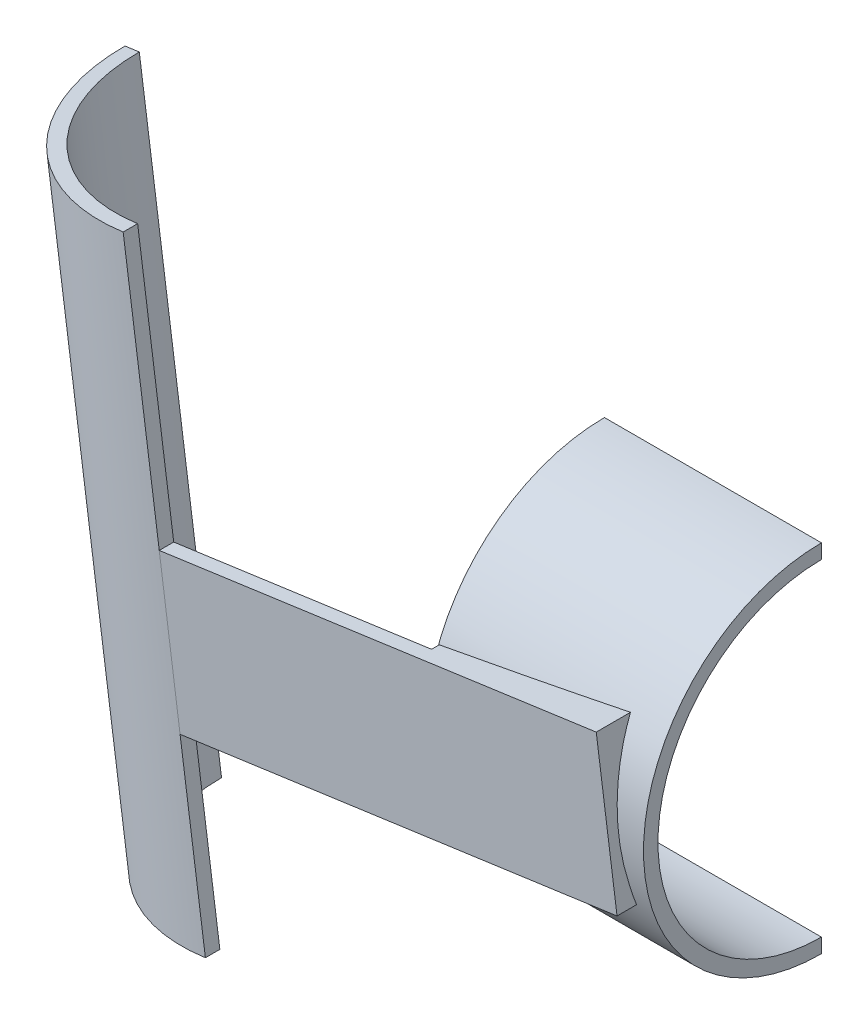
ISO-10303-21;
HEADER;
FILE_DESCRIPTION(('STEP AP214'),'2;1');
FILE_NAME('part.step','',(''),(''),'','','');
FILE_SCHEMA(('AUTOMOTIVE_DESIGN { 1 0 10303 214 1 1 1 1 }'));
ENDSEC;
DATA;
#1=APPLICATION_CONTEXT('core data for automotive mechanical design processes');
#2=APPLICATION_PROTOCOL_DEFINITION('international standard','automotive_design',2000,#1);
#3=PRODUCT_CONTEXT('',#1,'mechanical');
#4=PRODUCT('Part','Part','',(#3));
#5=PRODUCT_RELATED_PRODUCT_CATEGORY('part','',(#4));
#6=PRODUCT_DEFINITION_FORMATION('','',#4);
#7=PRODUCT_DEFINITION_CONTEXT('part definition',#1,'design');
#8=PRODUCT_DEFINITION('design','',#6,#7);
#9=PRODUCT_DEFINITION_SHAPE('','',#8);
#10=(LENGTH_UNIT() NAMED_UNIT(*) SI_UNIT(.MILLI.,.METRE.));
#11=(NAMED_UNIT(*) PLANE_ANGLE_UNIT() SI_UNIT($,.RADIAN.));
#12=(NAMED_UNIT(*) SI_UNIT($,.STERADIAN.) SOLID_ANGLE_UNIT());
#13=UNCERTAINTY_MEASURE_WITH_UNIT(LENGTH_MEASURE(1.E-05),#10,'distance_accuracy_value','');
#14=(GEOMETRIC_REPRESENTATION_CONTEXT(3) GLOBAL_UNCERTAINTY_ASSIGNED_CONTEXT((#13)) GLOBAL_UNIT_ASSIGNED_CONTEXT((#10,
#11,#12)) REPRESENTATION_CONTEXT('',''));
#15=CARTESIAN_POINT('',(0.,0.,0.));
#16=DIRECTION('',(0.,0.,1.));
#17=DIRECTION('',(1.,0.,0.));
#18=AXIS2_PLACEMENT_3D('',#15,#16,#17);
#19=CARTESIAN_POINT('',(455.481917252767,857.898759870621,0.));
#20=DIRECTION('',(1.,0.,0.));
#21=DIRECTION('',(0.,0.,-1.));
#22=AXIS2_PLACEMENT_3D('',#19,#20,#21);
#23=PLANE('',#22);
#24=DIRECTION('',(0.,-1.,0.));
#25=VECTOR('',#24,1.);
#26=CARTESIAN_POINT('',(455.481917252767,857.898759870621,24.));
#27=LINE('',#26,#25);
#28=CARTESIAN_POINT('',(455.481917252767,863.298759870621,24.));
#29=VERTEX_POINT('',#28);
#30=CARTESIAN_POINT('',(455.481917252767,852.498759870621,24.));
#31=VERTEX_POINT('',#30);
#32=EDGE_CURVE('E287',#29,#31,#27,.T.);
#33=ORIENTED_EDGE('',*,*,#32,.F.);
#34=CARTESIAN_POINT('',(455.481917252767,857.898759870621,0.));
#35=DIRECTION('',(1.,0.,0.));
#36=DIRECTION('',(0.,0.,-1.));
#37=AXIS2_PLACEMENT_3D('',#34,#35,#36);
#38=CIRCLE('',#37,24.6);
#39=CARTESIAN_POINT('',(455.481917252767,882.498759870621,0.));
#40=VERTEX_POINT('',#39);
#41=EDGE_CURVE('E290',#40,#29,#38,.T.);
#42=ORIENTED_EDGE('',*,*,#41,.F.);
#43=DIRECTION('',(0.,-1.,0.));
#44=VECTOR('',#43,1.);
#45=CARTESIAN_POINT('',(455.481917252767,857.898759870621,0.));
#46=LINE('',#45,#44);
#47=CARTESIAN_POINT('',(455.481917252767,880.498759870621,0.));
#48=VERTEX_POINT('',#47);
#49=EDGE_CURVE('E367',#40,#48,#46,.T.);
#50=ORIENTED_EDGE('',*,*,#49,.T.);
#51=CARTESIAN_POINT('',(455.481917252767,857.898759870621,0.));
#52=DIRECTION('',(1.,0.,0.));
#53=DIRECTION('',(0.,0.,-1.));
#54=AXIS2_PLACEMENT_3D('',#51,#52,#53);
#55=CIRCLE('',#54,22.6);
#56=CARTESIAN_POINT('',(455.481917252767,835.298759870621,0.));
#57=VERTEX_POINT('',#56);
#58=EDGE_CURVE('E377',#48,#57,#55,.T.);
#59=ORIENTED_EDGE('',*,*,#58,.T.);
#60=CARTESIAN_POINT('',(455.481917252767,833.298759870621,0.));
#61=VERTEX_POINT('',#60);
#62=EDGE_CURVE('E294',#57,#61,#46,.T.);
#63=ORIENTED_EDGE('',*,*,#62,.T.);
#64=EDGE_CURVE('E292',#31,#61,#38,.T.);
#65=ORIENTED_EDGE('',*,*,#64,.F.);
#66=EDGE_LOOP('',(#33,#42,#50,#59,#63,#65));
#67=FACE_BOUND('',#66,.T.);
#68=ADVANCED_FACE('F45',(#67),#23,.F.);
#69=CARTESIAN_POINT('',(485.481917252767,857.898759870621,0.));
#70=DIRECTION('',(-1.,0.,0.));
#71=DIRECTION('',(0.,0.,1.));
#72=AXIS2_PLACEMENT_3D('',#69,#70,#71);
#73=CYLINDRICAL_SURFACE('',#72,24.6);
#74=CARTESIAN_POINT('',(482.076684210732,857.898759870621,0.));
#75=DIRECTION('',(-0.990343871933616,-0.138632663263508,0.));
#76=DIRECTION('',(-0.138632663263508,0.990343871933616,0.));
#77=AXIS2_PLACEMENT_3D('',#74,#75,#76);
#78=ELLIPSE('',#77,24.8398568387859,24.6);
#79=CARTESIAN_POINT('',(482.843014101078,852.424363772919,23.9831396478179));
#80=VERTEX_POINT('',#79);
#81=CARTESIAN_POINT('',(480.344576988352,870.272335713676,21.2615761611451));
#82=VERTEX_POINT('',#81);
#83=EDGE_CURVE('E316',#80,#82,#78,.T.);
#84=ORIENTED_EDGE('',*,*,#83,.F.);
#85=CARTESIAN_POINT('',(482.843014099815,852.424363781945,23.9831396495386));
#86=CARTESIAN_POINT('',(482.652340246686,852.535565199958,24.0085006754069));
#87=CARTESIAN_POINT('',(482.457527070441,852.639934937279,24.0315323225289));
#88=CARTESIAN_POINT('',(482.061444218084,852.83590177468,24.0735906768672));
#89=CARTESIAN_POINT('',(481.860182886024,852.927514621668,24.0926223366632));
#90=CARTESIAN_POINT('',(481.453864969648,853.098573819852,24.1272815570814));
#91=CARTESIAN_POINT('',(481.248841466794,853.178095226819,24.1429303954495));
#92=CARTESIAN_POINT('',(480.83488909698,853.326911007925,24.1715518300321));
#93=CARTESIAN_POINT('',(480.62595893099,853.396201909586,24.1845235181491));
#94=CARTESIAN_POINT('',(479.998604842289,853.589385800425,24.2199628100896));
#95=CARTESIAN_POINT('',(479.575915394469,853.700086880683,24.2392480070946));
#96=CARTESIAN_POINT('',(478.936956274502,853.845890038337,24.2638936503835));
#97=CARTESIAN_POINT('',(478.722932069228,853.89115152634,24.2714005426008));
#98=CARTESIAN_POINT('',(478.293662335521,853.975733322033,24.2852162081717));
#99=CARTESIAN_POINT('',(478.078416815142,854.015053668847,24.2915249894153));
#100=CARTESIAN_POINT('',(477.44987781744,854.122119429336,24.3084779791677));
#101=CARTESIAN_POINT('',(477.035382936894,854.182997475411,24.3178144676817));
#102=CARTESIAN_POINT('',(476.204433757126,854.290167287182,24.3339462848098));
#103=CARTESIAN_POINT('',(475.78797904015,854.33645578544,24.3407410442481));
#104=CARTESIAN_POINT('',(474.953647200662,854.417619736405,24.3524812102101));
#105=CARTESIAN_POINT('',(474.535769263853,854.452486862926,24.3574252679443));
#106=CARTESIAN_POINT('',(473.699328950489,854.51310658481,24.3659241979324));
#107=CARTESIAN_POINT('',(473.280766530062,854.538858570962,24.3694789773355));
#108=CARTESIAN_POINT('',(472.022167456743,854.60533425651,24.378586189657));
#109=CARTESIAN_POINT('',(471.181545269864,854.635073564196,24.3825529361513));
#110=CARTESIAN_POINT('',(469.500285156752,854.675016354223,24.3878607837121));
#111=CARTESIAN_POINT('',(468.659647395258,854.685228298316,24.3892030220569));
#112=CARTESIAN_POINT('',(466.939715654944,854.692044544336,24.3901002732503));
#113=CARTESIAN_POINT('',(466.060419771777,854.688002230657,24.389570357594));
#114=CARTESIAN_POINT('',(464.301832650118,854.669111105728,24.3870753382253));
#115=CARTESIAN_POINT('',(463.422541431772,854.654260687186,24.3851100210517));
#116=CARTESIAN_POINT('',(461.671023158028,854.616708815844,24.3800839401694));
#117=CARTESIAN_POINT('',(460.798794682882,854.594069728138,24.3770318716561));
#118=CARTESIAN_POINT('',(459.054707382984,854.5426764585,24.3700100452513));
#119=CARTESIAN_POINT('',(458.182848519075,854.513923593524,24.366040484979));
#120=CARTESIAN_POINT('',(457.311081965592,854.482987781759,24.3617015217934));
#121=B_SPLINE_CURVE_WITH_KNOTS('',3,(#85,#86,#87,#88,#89,#90,#91,#92,#93,#94,#95,#96,#97,#98,
#99,#100,#101,#102,#103,#104,#105,#106,#107,#108,#109,#110,#111,#112,#113,#114,#115,#116,#117,
#118,#119,#120),.UNSPECIFIED.,.F.,.F.,(4,2,2,2,2,2,2,2,2,2,2,2,2,2,2,2,2,4),(0.,
0.666202281359726,1.33157478152916,1.99263180500969,2.65391269381922,3.96450875512513,
4.6211244407151,5.27773580206175,6.53448720147265,7.79151986014576,9.0494668674369,
10.3074979337999,12.8305616674893,15.3525318392474,17.9903489039542,20.6285583232397,
23.246116753004,25.8631119099057),.UNSPECIFIED.);
#122=CARTESIAN_POINT('',(482.713007309139,852.498759870621,24.));
#123=VERTEX_POINT('',#122);
#124=EDGE_CURVE('E212',#80,#123,#121,.T.);
#125=ORIENTED_EDGE('',*,*,#124,.T.);
#126=DIRECTION('',(-1.,0.,0.));
#127=VECTOR('',#126,1.);
#128=CARTESIAN_POINT('',(485.481917252767,852.498759870621,24.));
#129=LINE('',#128,#127);
#130=EDGE_CURVE('E62',#31,#123,#129,.F.);
#131=ORIENTED_EDGE('',*,*,#130,.F.);
#132=ORIENTED_EDGE('',*,*,#64,.T.);
#133=DIRECTION('',(-1.,0.,0.));
#134=VECTOR('',#133,1.);
#135=CARTESIAN_POINT('',(485.481917252767,833.298759870621,0.));
#136=LINE('',#135,#134);
#137=CARTESIAN_POINT('',(485.481917252767,833.298759870621,0.));
#138=VERTEX_POINT('',#137);
#139=EDGE_CURVE('E370',#61,#138,#136,.F.);
#140=ORIENTED_EDGE('',*,*,#139,.T.);
#141=CARTESIAN_POINT('',(485.481917252767,857.898759870621,0.));
#142=DIRECTION('',(1.,0.,0.));
#143=DIRECTION('',(0.,0.,-1.));
#144=AXIS2_PLACEMENT_3D('',#141,#142,#143);
#145=CIRCLE('',#144,24.6);
#146=CARTESIAN_POINT('',(485.481917252767,882.498759870621,0.));
#147=VERTEX_POINT('',#146);
#148=EDGE_CURVE('E301',#147,#138,#145,.T.);
#149=ORIENTED_EDGE('',*,*,#148,.F.);
#150=DIRECTION('',(-1.,0.,0.));
#151=VECTOR('',#150,1.);
#152=CARTESIAN_POINT('',(485.481917252767,882.498759870621,0.));
#153=LINE('',#152,#151);
#154=EDGE_CURVE('E299',#147,#40,#153,.T.);
#155=ORIENTED_EDGE('',*,*,#154,.T.);
#156=ORIENTED_EDGE('',*,*,#41,.T.);
#157=DIRECTION('',(-1.,0.,0.));
#158=VECTOR('',#157,1.);
#159=CARTESIAN_POINT('',(485.481917252767,863.298759870621,24.));
#160=LINE('',#159,#158);
#161=CARTESIAN_POINT('',(456.077011661288,863.298759870621,24.));
#162=VERTEX_POINT('',#161);
#163=EDGE_CURVE('E55',#162,#29,#160,.T.);
#164=ORIENTED_EDGE('',*,*,#163,.F.);
#165=CARTESIAN_POINT('',(456.832927260746,857.898759870621,0.));
#166=DIRECTION('',(-0.990343871933616,-0.138632663263508,0.));
#167=DIRECTION('',(-0.138632663263508,0.990343871933616,0.));
#168=AXIS2_PLACEMENT_3D('',#165,#166,#167);
#169=ELLIPSE('',#168,24.8398568387859,24.6);
#170=CARTESIAN_POINT('',(455.585980190012,866.806519132088,22.9305871041225));
#171=VERTEX_POINT('',#170);
#172=EDGE_CURVE('E208',#162,#171,#169,.T.);
#173=ORIENTED_EDGE('',*,*,#172,.T.);
#174=CARTESIAN_POINT('',(391.952024168511,857.898759870621,0.));
#175=DIRECTION('',(-0.138632663263508,0.990343871933616,0.));
#176=DIRECTION('',(-0.990343871933616,-0.138632663263508,0.));
#177=AXIS2_PLACEMENT_3D('',#174,#175,#176);
#178=ELLIPSE('',#177,177.447359236266,24.6);
#179=EDGE_CURVE('E190',#171,#82,#178,.T.);
#180=ORIENTED_EDGE('',*,*,#179,.T.);
#181=EDGE_LOOP('',(#84,#125,#131,#132,#140,#149,#155,#156,#164,#173,#180));
#182=FACE_BOUND('',#181,.T.);
#183=ADVANCED_FACE('F47',(#182),#73,.T.);
#184=CARTESIAN_POINT('',(485.481917252767,857.898759870621,0.));
#185=DIRECTION('',(1.,0.,0.));
#186=DIRECTION('',(0.,0.,-1.));
#187=AXIS2_PLACEMENT_3D('',#184,#185,#186);
#188=PLANE('',#187);
#189=DIRECTION('',(0.,-1.,0.));
#190=VECTOR('',#189,1.);
#191=CARTESIAN_POINT('',(485.481917252767,857.898759870621,0.));
#192=LINE('',#191,#190);
#193=CARTESIAN_POINT('',(485.481917252767,880.498759870621,0.));
#194=VERTEX_POINT('',#193);
#195=EDGE_CURVE('E371',#147,#194,#192,.T.);
#196=ORIENTED_EDGE('',*,*,#195,.F.);
#197=ORIENTED_EDGE('',*,*,#148,.T.);
#198=CARTESIAN_POINT('',(485.481917252767,835.298759870621,0.));
#199=VERTEX_POINT('',#198);
#200=EDGE_CURVE('E366',#199,#138,#192,.T.);
#201=ORIENTED_EDGE('',*,*,#200,.F.);
#202=CARTESIAN_POINT('',(485.481917252767,857.898759870621,0.));
#203=DIRECTION('',(1.,0.,0.));
#204=DIRECTION('',(0.,0.,-1.));
#205=AXIS2_PLACEMENT_3D('',#202,#203,#204);
#206=CIRCLE('',#205,22.6);
#207=EDGE_CURVE('E308',#194,#199,#206,.T.);
#208=ORIENTED_EDGE('',*,*,#207,.F.);
#209=EDGE_LOOP('',(#196,#197,#201,#208));
#210=FACE_BOUND('',#209,.T.);
#211=ADVANCED_FACE('F277',(#210),#188,.T.);
#212=CARTESIAN_POINT('',(485.481917252767,857.898759870621,0.));
#213=DIRECTION('',(-1.,0.,0.));
#214=DIRECTION('',(0.,0.,1.));
#215=AXIS2_PLACEMENT_3D('',#212,#213,#214);
#216=CYLINDRICAL_SURFACE('',#215,22.6);
#217=DIRECTION('',(-1.,0.,0.));
#218=VECTOR('',#217,1.);
#219=CARTESIAN_POINT('',(485.481917252767,880.498759870621,0.));
#220=LINE('',#219,#218);
#221=EDGE_CURVE('E313',#194,#48,#220,.T.);
#222=ORIENTED_EDGE('',*,*,#221,.F.);
#223=ORIENTED_EDGE('',*,*,#207,.T.);
#224=DIRECTION('',(-1.,0.,0.));
#225=VECTOR('',#224,1.);
#226=CARTESIAN_POINT('',(485.481917252767,835.298759870621,0.));
#227=LINE('',#226,#225);
#228=EDGE_CURVE('E306',#57,#199,#227,.F.);
#229=ORIENTED_EDGE('',*,*,#228,.F.);
#230=ORIENTED_EDGE('',*,*,#58,.F.);
#231=EDGE_LOOP('',(#222,#223,#229,#230));
#232=FACE_BOUND('',#231,.T.);
#233=ADVANCED_FACE('F274',(#232),#216,.F.);
#234=CARTESIAN_POINT('',(0.,0.,0.));
#235=DIRECTION('',(0.,0.,1.));
#236=DIRECTION('',(1.,0.,0.));
#237=AXIS2_PLACEMENT_3D('',#234,#235,#236);
#238=PLANE('',#237);
#239=ORIENTED_EDGE('',*,*,#62,.F.);
#240=ORIENTED_EDGE('',*,*,#228,.T.);
#241=ORIENTED_EDGE('',*,*,#200,.T.);
#242=ORIENTED_EDGE('',*,*,#139,.F.);
#243=EDGE_LOOP('',(#239,#240,#241,#242));
#244=FACE_BOUND('',#243,.T.);
#245=ADVANCED_FACE('F272',(#244),#238,.F.);
#246=ORIENTED_EDGE('',*,*,#195,.T.);
#247=ORIENTED_EDGE('',*,*,#221,.T.);
#248=ORIENTED_EDGE('',*,*,#49,.F.);
#249=ORIENTED_EDGE('',*,*,#154,.F.);
#250=EDGE_LOOP('',(#246,#247,#248,#249));
#251=FACE_BOUND('',#250,.T.);
#252=ADVANCED_FACE('F269',(#251),#238,.F.);
#253=CARTESIAN_POINT('',(480.344576988352,870.272335713678,24.));
#254=DIRECTION('',(0.,0.,1.));
#255=DIRECTION('',(0.,-1.,0.));
#256=AXIS2_PLACEMENT_3D('',#253,#254,#255);
#257=PLANE('',#256);
#258=DIRECTION('',(-0.990343871933616,-0.138632663263512,0.));
#259=VECTOR('',#258,1.);
#260=CARTESIAN_POINT('',(480.344576988352,870.272335713678,24.));
#261=LINE('',#260,#259);
#262=CARTESIAN_POINT('',(455.585980190012,866.806519132088,24.));
#263=VERTEX_POINT('',#262);
#264=CARTESIAN_POINT('',(419.933600800401,861.815743254604,24.));
#265=VERTEX_POINT('',#264);
#266=EDGE_CURVE('E295',#263,#265,#261,.T.);
#267=ORIENTED_EDGE('',*,*,#266,.F.);
#268=DIRECTION('',(0.138632663263508,-0.990343871933616,0.));
#269=VECTOR('',#268,1.);
#270=CARTESIAN_POINT('',(455.585980190012,866.80651913209,24.));
#271=LINE('',#270,#269);
#272=EDGE_CURVE('E207',#263,#162,#271,.T.);
#273=ORIENTED_EDGE('',*,*,#272,.T.);
#274=ORIENTED_EDGE('',*,*,#163,.T.);
#275=ORIENTED_EDGE('',*,*,#32,.T.);
#276=ORIENTED_EDGE('',*,*,#130,.T.);
#277=DIRECTION('',(0.990343871933616,0.138632663263508,0.));
#278=VECTOR('',#277,1.);
#279=CARTESIAN_POINT('',(458.07170456174,849.049362622891,24.));
#280=LINE('',#279,#278);
#281=CARTESIAN_POINT('',(458.07170456174,849.049362622891,24.0000000000001));
#282=VERTEX_POINT('',#281);
#283=EDGE_CURVE('E11',#123,#282,#280,.F.);
#284=ORIENTED_EDGE('',*,*,#283,.T.);
#285=CARTESIAN_POINT('',(458.466105689158,846.231897168303,24.));
#286=VERTEX_POINT('',#285);
#287=EDGE_CURVE('E193',#282,#286,#271,.T.);
#288=ORIENTED_EDGE('',*,*,#287,.T.);
#289=DIRECTION('',(-0.990343871933616,-0.138632663263512,0.));
#290=VECTOR('',#289,1.);
#291=CARTESIAN_POINT('',(483.224702487498,849.697713749893,24.));
#292=LINE('',#291,#290);
#293=CARTESIAN_POINT('',(422.813726299548,841.241121290819,24.));
#294=VERTEX_POINT('',#293);
#295=EDGE_CURVE('E175',#286,#294,#292,.T.);
#296=ORIENTED_EDGE('',*,*,#295,.T.);
#297=DIRECTION('',(-0.138632663263508,0.990343871933616,0.));
#298=VECTOR('',#297,1.);
#299=CARTESIAN_POINT('',(419.933600800401,861.815743254604,24.));
#300=LINE('',#299,#298);
#301=EDGE_CURVE('E345',#294,#265,#300,.T.);
#302=ORIENTED_EDGE('',*,*,#301,.T.);
#303=EDGE_LOOP('',(#267,#273,#274,#275,#276,#284,#288,#296,#302));
#304=FACE_BOUND('',#303,.T.);
#305=ADVANCED_FACE('F265',(#304),#257,.F.);
#306=CARTESIAN_POINT('',(480.344576988352,870.272335713678,24.));
#307=DIRECTION('',(0.138632663263512,-0.990343871933616,0.));
#308=DIRECTION('',(0.990343871933616,0.138632663263512,0.));
#309=AXIS2_PLACEMENT_3D('',#306,#307,#308);
#310=PLANE('',#309);
#311=DIRECTION('',(0.,0.,1.));
#312=VECTOR('',#311,1.);
#313=CARTESIAN_POINT('',(419.933600800401,861.815743254604,24.));
#314=LINE('',#313,#312);
#315=CARTESIAN_POINT('',(419.933600800401,861.815743254604,26.));
#316=VERTEX_POINT('',#315);
#317=EDGE_CURVE('E349',#265,#316,#314,.T.);
#318=ORIENTED_EDGE('',*,*,#317,.T.);
#319=DIRECTION('',(-0.990343871933616,-0.138632663263512,0.));
#320=VECTOR('',#319,1.);
#321=CARTESIAN_POINT('',(480.344576988352,870.272335713678,26.));
#322=LINE('',#321,#320);
#323=CARTESIAN_POINT('',(480.344576988352,870.272335713678,26.));
#324=VERTEX_POINT('',#323);
#325=EDGE_CURVE('E327',#324,#316,#322,.T.);
#326=ORIENTED_EDGE('',*,*,#325,.F.);
#327=DIRECTION('',(0.,0.,1.));
#328=VECTOR('',#327,1.);
#329=CARTESIAN_POINT('',(480.344576988352,870.272335713678,24.));
#330=LINE('',#329,#328);
#331=EDGE_CURVE('E323',#82,#324,#330,.T.);
#332=ORIENTED_EDGE('',*,*,#331,.F.);
#333=ORIENTED_EDGE('',*,*,#179,.F.);
#334=DIRECTION('',(0.,0.,1.));
#335=VECTOR('',#334,1.);
#336=CARTESIAN_POINT('',(455.585980190012,866.806519132088,26.));
#337=LINE('',#336,#335);
#338=EDGE_CURVE('E180',#171,#263,#337,.T.);
#339=ORIENTED_EDGE('',*,*,#338,.T.);
#340=ORIENTED_EDGE('',*,*,#266,.T.);
#341=EDGE_LOOP('',(#318,#326,#332,#333,#339,#340));
#342=FACE_BOUND('',#341,.T.);
#343=ADVANCED_FACE('F261',(#342),#310,.F.);
#344=CARTESIAN_POINT('',(480.344576988352,870.272335713678,26.));
#345=DIRECTION('',(0.,0.,-1.));
#346=DIRECTION('',(-1.,0.,0.));
#347=AXIS2_PLACEMENT_3D('',#344,#345,#346);
#348=PLANE('',#347);
#349=DIRECTION('',(0.138632663263508,-0.990343871933616,0.));
#350=VECTOR('',#349,1.);
#351=CARTESIAN_POINT('',(419.933600800401,861.815743254604,26.));
#352=LINE('',#351,#350);
#353=CARTESIAN_POINT('',(422.813726299548,841.241121290819,26.));
#354=VERTEX_POINT('',#353);
#355=EDGE_CURVE('E337',#316,#354,#352,.T.);
#356=ORIENTED_EDGE('',*,*,#355,.T.);
#357=DIRECTION('',(-0.990343871933616,-0.138632663263512,0.));
#358=VECTOR('',#357,1.);
#359=CARTESIAN_POINT('',(483.224702487498,849.697713749893,26.));
#360=LINE('',#359,#358);
#361=CARTESIAN_POINT('',(483.224702487498,849.697713749893,26.));
#362=VERTEX_POINT('',#361);
#363=EDGE_CURVE('E357',#362,#354,#360,.T.);
#364=ORIENTED_EDGE('',*,*,#363,.F.);
#365=DIRECTION('',(0.138632663263508,-0.990343871933616,0.));
#366=VECTOR('',#365,1.);
#367=CARTESIAN_POINT('',(480.344576988352,870.272335713678,26.));
#368=LINE('',#367,#366);
#369=EDGE_CURVE('E330',#324,#362,#368,.T.);
#370=ORIENTED_EDGE('',*,*,#369,.F.);
#371=ORIENTED_EDGE('',*,*,#325,.T.);
#372=EDGE_LOOP('',(#356,#364,#370,#371));
#373=FACE_BOUND('',#372,.T.);
#374=ADVANCED_FACE('F258',(#373),#348,.F.);
#375=CARTESIAN_POINT('',(483.224702487498,849.697713749893,24.));
#376=DIRECTION('',(-0.138632663263512,0.990343871933616,0.));
#377=DIRECTION('',(-0.990343871933616,-0.138632663263512,0.));
#378=AXIS2_PLACEMENT_3D('',#375,#376,#377);
#379=PLANE('',#378);
#380=ORIENTED_EDGE('',*,*,#295,.F.);
#381=DIRECTION('',(0.,0.,-1.));
#382=VECTOR('',#381,1.);
#383=CARTESIAN_POINT('',(458.466105689158,846.231897168303,26.));
#384=LINE('',#383,#382);
#385=CARTESIAN_POINT('',(458.466105689158,846.231897168303,23.3020524861987));
#386=VERTEX_POINT('',#385);
#387=EDGE_CURVE('E168',#286,#386,#384,.T.);
#388=ORIENTED_EDGE('',*,*,#387,.T.);
#389=DIRECTION('',(0.990343871933616,0.138632663263508,0.));
#390=VECTOR('',#389,1.);
#391=CARTESIAN_POINT('',(458.466105689158,846.231897168303,23.3020524861987));
#392=LINE('',#391,#390);
#393=CARTESIAN_POINT('',(483.224702487499,849.697713749891,23.3020524861987));
#394=VERTEX_POINT('',#393);
#395=EDGE_CURVE('E172',#386,#394,#392,.T.);
#396=ORIENTED_EDGE('',*,*,#395,.T.);
#397=DIRECTION('',(0.,0.,-1.));
#398=VECTOR('',#397,1.);
#399=CARTESIAN_POINT('',(483.224702487498,849.697713749893,24.));
#400=LINE('',#399,#398);
#401=EDGE_CURVE('E335',#362,#394,#400,.T.);
#402=ORIENTED_EDGE('',*,*,#401,.F.);
#403=ORIENTED_EDGE('',*,*,#363,.T.);
#404=DIRECTION('',(0.,0.,-1.));
#405=VECTOR('',#404,1.);
#406=CARTESIAN_POINT('',(422.813726299548,841.241121290819,24.));
#407=LINE('',#406,#405);
#408=EDGE_CURVE('E331',#354,#294,#407,.T.);
#409=ORIENTED_EDGE('',*,*,#408,.T.);
#410=EDGE_LOOP('',(#380,#388,#396,#402,#403,#409));
#411=FACE_BOUND('',#410,.T.);
#412=ADVANCED_FACE('F170',(#411),#379,.F.);
#413=CARTESIAN_POINT('',(590.59600467061,82.6742097978695,0.));
#414=DIRECTION('',(-0.990343871933616,-0.138632663263508,0.));
#415=DIRECTION('',(0.138632663263508,-0.990343871933616,0.));
#416=AXIS2_PLACEMENT_3D('',#413,#414,#415);
#417=PLANE('',#416);
#418=ORIENTED_EDGE('',*,*,#401,.T.);
#419=CARTESIAN_POINT('',(482.231155302325,856.795271736236,0.236445165393208));
#420=DIRECTION('',(-0.990343871933616,-0.138632663263508,0.));
#421=DIRECTION('',(0.138632663263508,-0.990343871933616,0.));
#422=AXIS2_PLACEMENT_3D('',#419,#420,#421);
#423=CIRCLE('',#422,24.1533580782526);
#424=EDGE_CURVE('E188',#394,#80,#423,.T.);
#425=ORIENTED_EDGE('',*,*,#424,.T.);
#426=ORIENTED_EDGE('',*,*,#83,.T.);
#427=ORIENTED_EDGE('',*,*,#331,.T.);
#428=ORIENTED_EDGE('',*,*,#369,.T.);
#429=EDGE_LOOP('',(#418,#425,#426,#427,#428));
#430=FACE_BOUND('',#429,.T.);
#431=ADVANCED_FACE('F236',(#430),#417,.F.);
#432=CARTESIAN_POINT('',(414.924769966481,897.597101018005,30.));
#433=DIRECTION('',(0.990343871933616,0.138632663263512,0.));
#434=DIRECTION('',(-0.138632663263512,0.990343871933616,0.));
#435=AXIS2_PLACEMENT_3D('',#432,#433,#434);
#436=PLANE('',#435);
#437=ORIENTED_EDGE('',*,*,#408,.F.);
#438=DIRECTION('',(0.138632663263512,-0.990343871933616,0.));
#439=VECTOR('',#438,1.);
#440=CARTESIAN_POINT('',(414.946253565643,897.443629604589,26.));
#441=LINE('',#440,#439);
#442=CARTESIAN_POINT('',(426.314131953251,816.235432106032,26.));
#443=VERTEX_POINT('',#442);
#444=EDGE_CURVE('E547',#443,#354,#441,.F.);
#445=ORIENTED_EDGE('',*,*,#444,.F.);
#446=DIRECTION('',(0.,0.,-1.));
#447=VECTOR('',#446,1.);
#448=CARTESIAN_POINT('',(426.314131953251,816.235432106032,30.));
#449=LINE('',#448,#447);
#450=CARTESIAN_POINT('',(426.314131953251,816.235432106032,24.));
#451=VERTEX_POINT('',#450);
#452=EDGE_CURVE('E537',#443,#451,#449,.T.);
#453=ORIENTED_EDGE('',*,*,#452,.T.);
#454=DIRECTION('',(0.138632663263512,-0.990343871933616,0.));
#455=VECTOR('',#454,1.);
#456=CARTESIAN_POINT('',(414.946253565643,897.443629604589,24.));
#457=LINE('',#456,#455);
#458=EDGE_CURVE('E569',#451,#294,#457,.F.);
#459=ORIENTED_EDGE('',*,*,#458,.T.);
#460=EDGE_LOOP('',(#437,#445,#453,#459));
#461=FACE_BOUND('',#460,.T.);
#462=ADVANCED_FACE('F232',(#461),#436,.T.);
#463=ORIENTED_EDGE('',*,*,#317,.F.);
#464=CARTESIAN_POINT('',(414.946253565643,897.443629604589,24.));
#465=VERTEX_POINT('',#464);
#466=EDGE_CURVE('E566',#265,#465,#457,.F.);
#467=ORIENTED_EDGE('',*,*,#466,.T.);
#468=DIRECTION('',(0.,0.,1.));
#469=VECTOR('',#468,1.);
#470=CARTESIAN_POINT('',(414.946253565643,897.443629604589,0.));
#471=LINE('',#470,#469);
#472=CARTESIAN_POINT('',(414.946253565643,897.443629604589,26.));
#473=VERTEX_POINT('',#472);
#474=EDGE_CURVE('E540',#465,#473,#471,.T.);
#475=ORIENTED_EDGE('',*,*,#474,.T.);
#476=EDGE_CURVE('E544',#316,#473,#441,.F.);
#477=ORIENTED_EDGE('',*,*,#476,.F.);
#478=EDGE_LOOP('',(#463,#467,#475,#477));
#479=FACE_BOUND('',#478,.T.);
#480=ADVANCED_FACE('F235',(#479),#436,.T.);
#481=CARTESIAN_POINT('',(414.946253565643,897.443629604589,0.));
#482=DIRECTION('',(0.138632663263512,-0.990343871933616,0.));
#483=DIRECTION('',(0.990343871933616,0.138632663263512,0.));
#484=AXIS2_PLACEMENT_3D('',#481,#482,#483);
#485=CYLINDRICAL_SURFACE('',#484,26.);
#486=DIRECTION('',(0.138632663263512,-0.990343871933616,0.));
#487=VECTOR('',#486,1.);
#488=CARTESIAN_POINT('',(389.197312895369,893.839180359737,0.));
#489=LINE('',#488,#487);
#490=CARTESIAN_POINT('',(400.565191282977,812.630982861181,0.));
#491=VERTEX_POINT('',#490);
#492=CARTESIAN_POINT('',(389.197312895369,893.839180359737,0.));
#493=VERTEX_POINT('',#492);
#494=EDGE_CURVE('E535',#491,#493,#489,.F.);
#495=ORIENTED_EDGE('',*,*,#494,.F.);
#496=CARTESIAN_POINT('',(426.314131953251,816.235432106032,0.));
#497=DIRECTION('',(0.138632663263512,-0.990343871933616,0.));
#498=DIRECTION('',(0.990343871933616,0.138632663263512,0.));
#499=AXIS2_PLACEMENT_3D('',#496,#497,#498);
#500=CIRCLE('',#499,26.);
#501=EDGE_CURVE('E558',#443,#491,#500,.T.);
#502=ORIENTED_EDGE('',*,*,#501,.F.);
#503=ORIENTED_EDGE('',*,*,#444,.T.);
#504=ORIENTED_EDGE('',*,*,#355,.F.);
#505=ORIENTED_EDGE('',*,*,#476,.T.);
#506=CARTESIAN_POINT('',(414.946253565643,897.443629604589,0.));
#507=DIRECTION('',(0.138632663263512,-0.990343871933616,0.));
#508=DIRECTION('',(0.990343871933616,0.138632663263512,0.));
#509=AXIS2_PLACEMENT_3D('',#506,#507,#508);
#510=CIRCLE('',#509,26.);
#511=EDGE_CURVE('E562',#473,#493,#510,.T.);
#512=ORIENTED_EDGE('',*,*,#511,.T.);
#513=EDGE_LOOP('',(#495,#502,#503,#504,#505,#512));
#514=FACE_BOUND('',#513,.T.);
#515=ADVANCED_FACE('F245',(#514),#485,.T.);
#516=CARTESIAN_POINT('',(414.946253565643,897.443629604589,0.));
#517=DIRECTION('',(0.138632663263512,-0.990343871933616,0.));
#518=DIRECTION('',(0.990343871933616,0.138632663263512,0.));
#519=AXIS2_PLACEMENT_3D('',#516,#517,#518);
#520=PLANE('',#519);
#521=CARTESIAN_POINT('',(414.946253565643,897.443629604589,0.));
#522=DIRECTION('',(0.138632663263512,-0.990343871933616,0.));
#523=DIRECTION('',(0.990343871933616,0.138632663263512,0.));
#524=AXIS2_PLACEMENT_3D('',#521,#522,#523);
#525=CIRCLE('',#524,24.);
#526=CARTESIAN_POINT('',(391.178000639236,894.116445686264,0.));
#527=VERTEX_POINT('',#526);
#528=EDGE_CURVE('E554',#465,#527,#525,.T.);
#529=ORIENTED_EDGE('',*,*,#528,.T.);
#530=DIRECTION('',(-0.990343871933616,-0.138632663263512,0.));
#531=VECTOR('',#530,1.);
#532=CARTESIAN_POINT('',(414.946253565643,897.443629604589,0.));
#533=LINE('',#532,#531);
#534=EDGE_CURVE('E532',#527,#493,#533,.T.);
#535=ORIENTED_EDGE('',*,*,#534,.T.);
#536=ORIENTED_EDGE('',*,*,#511,.F.);
#537=ORIENTED_EDGE('',*,*,#474,.F.);
#538=EDGE_LOOP('',(#529,#535,#536,#537));
#539=FACE_BOUND('',#538,.T.);
#540=ADVANCED_FACE('F242',(#539),#520,.F.);
#541=CARTESIAN_POINT('',(426.314131953251,816.235432106032,0.));
#542=DIRECTION('',(0.138632663263512,-0.990343871933616,0.));
#543=DIRECTION('',(0.990343871933616,0.138632663263512,0.));
#544=AXIS2_PLACEMENT_3D('',#541,#542,#543);
#545=PLANE('',#544);
#546=DIRECTION('',(-0.990343871933616,-0.138632663263512,0.));
#547=VECTOR('',#546,1.);
#548=CARTESIAN_POINT('',(426.314131953251,816.235432106032,0.));
#549=LINE('',#548,#547);
#550=CARTESIAN_POINT('',(402.545879026844,812.908248187708,0.));
#551=VERTEX_POINT('',#550);
#552=EDGE_CURVE('E220',#551,#491,#549,.T.);
#553=ORIENTED_EDGE('',*,*,#552,.F.);
#554=CARTESIAN_POINT('',(426.314131953251,816.235432106032,0.));
#555=DIRECTION('',(0.138632663263512,-0.990343871933616,0.));
#556=DIRECTION('',(0.990343871933616,0.138632663263512,0.));
#557=AXIS2_PLACEMENT_3D('',#554,#555,#556);
#558=CIRCLE('',#557,24.);
#559=EDGE_CURVE('E551',#451,#551,#558,.T.);
#560=ORIENTED_EDGE('',*,*,#559,.F.);
#561=ORIENTED_EDGE('',*,*,#452,.F.);
#562=ORIENTED_EDGE('',*,*,#501,.T.);
#563=EDGE_LOOP('',(#553,#560,#561,#562));
#564=FACE_BOUND('',#563,.T.);
#565=ADVANCED_FACE('F240',(#564),#545,.T.);
#566=CARTESIAN_POINT('',(414.946253565643,897.443629604589,0.));
#567=DIRECTION('',(0.138632663263512,-0.990343871933616,0.));
#568=DIRECTION('',(0.990343871933616,0.138632663263512,0.));
#569=AXIS2_PLACEMENT_3D('',#566,#567,#568);
#570=CYLINDRICAL_SURFACE('',#569,24.);
#571=ORIENTED_EDGE('',*,*,#559,.T.);
#572=DIRECTION('',(0.138632663263512,-0.990343871933616,0.));
#573=VECTOR('',#572,1.);
#574=CARTESIAN_POINT('',(391.178000639236,894.116445686264,0.));
#575=LINE('',#574,#573);
#576=EDGE_CURVE('E340',#551,#527,#575,.F.);
#577=ORIENTED_EDGE('',*,*,#576,.T.);
#578=ORIENTED_EDGE('',*,*,#528,.F.);
#579=ORIENTED_EDGE('',*,*,#466,.F.);
#580=ORIENTED_EDGE('',*,*,#301,.F.);
#581=ORIENTED_EDGE('',*,*,#458,.F.);
#582=EDGE_LOOP('',(#571,#577,#578,#579,#580,#581));
#583=FACE_BOUND('',#582,.T.);
#584=ADVANCED_FACE('F230',(#583),#570,.F.);
#585=CARTESIAN_POINT('',(0.,0.,0.));
#586=DIRECTION('',(0.,0.,1.));
#587=DIRECTION('',(1.,0.,0.));
#588=AXIS2_PLACEMENT_3D('',#585,#586,#587);
#589=PLANE('',#588);
#590=ORIENTED_EDGE('',*,*,#494,.T.);
#591=ORIENTED_EDGE('',*,*,#534,.F.);
#592=ORIENTED_EDGE('',*,*,#576,.F.);
#593=ORIENTED_EDGE('',*,*,#552,.T.);
#594=EDGE_LOOP('',(#590,#591,#592,#593));
#595=FACE_BOUND('',#594,.T.);
#596=ADVANCED_FACE('F227',(#595),#589,.F.);
#597=CARTESIAN_POINT('',(457.472558503984,853.329455154648,0.236445165393208));
#598=DIRECTION('',(-0.990343871933616,-0.138632663263508,0.));
#599=DIRECTION('',(0.138632663263508,-0.990343871933616,0.));
#600=AXIS2_PLACEMENT_3D('',#597,#598,#599);
#601=PLANE('',#600);
#602=ORIENTED_EDGE('',*,*,#287,.F.);
#603=CARTESIAN_POINT('',(457.472558503984,853.329455154648,0.236445165393208));
#604=DIRECTION('',(-0.990343871933616,-0.138632663263508,0.));
#605=DIRECTION('',(0.138632663263508,-0.990343871933616,0.));
#606=AXIS2_PLACEMENT_3D('',#603,#604,#605);
#607=CIRCLE('',#606,24.1533580782526);
#608=EDGE_CURVE('E186',#386,#282,#607,.T.);
#609=ORIENTED_EDGE('',*,*,#608,.F.);
#610=ORIENTED_EDGE('',*,*,#387,.F.);
#611=EDGE_LOOP('',(#602,#609,#610));
#612=FACE_BOUND('',#611,.T.);
#613=ADVANCED_FACE('F192',(#612),#601,.T.);
#614=CARTESIAN_POINT('',(457.472558503984,853.329455154648,0.236445165393208));
#615=DIRECTION('',(0.990343871933616,0.138632663263508,0.));
#616=DIRECTION('',(-0.138632663263508,0.990343871933616,0.));
#617=AXIS2_PLACEMENT_3D('',#614,#615,#616);
#618=CYLINDRICAL_SURFACE('',#617,24.1533580782526);
#619=ORIENTED_EDGE('',*,*,#124,.F.);
#620=ORIENTED_EDGE('',*,*,#424,.F.);
#621=ORIENTED_EDGE('',*,*,#395,.F.);
#622=ORIENTED_EDGE('',*,*,#608,.T.);
#623=ORIENTED_EDGE('',*,*,#283,.F.);
#624=EDGE_LOOP('',(#619,#620,#621,#622,#623));
#625=FACE_BOUND('',#624,.T.);
#626=ADVANCED_FACE('F185',(#625),#618,.F.);
#627=ORIENTED_EDGE('',*,*,#172,.F.);
#628=ORIENTED_EDGE('',*,*,#272,.F.);
#629=ORIENTED_EDGE('',*,*,#338,.F.);
#630=EDGE_LOOP('',(#627,#628,#629));
#631=FACE_BOUND('',#630,.T.);
#632=ADVANCED_FACE('F226',(#631),#601,.T.);
#633=CLOSED_SHELL('',(#68,#183,#211,#233,#245,#252,#305,#343,#374,#412,#431,#462,#480,#515,#540,
#565,#584,#596,#613,#626,#632));
#634=MANIFOLD_SOLID_BREP('B2',#633);
#635=ADVANCED_BREP_SHAPE_REPRESENTATION('',(#18,#634),#14);
#636=SHAPE_DEFINITION_REPRESENTATION(#9,#635);
ENDSEC;
END-ISO-10303-21;
